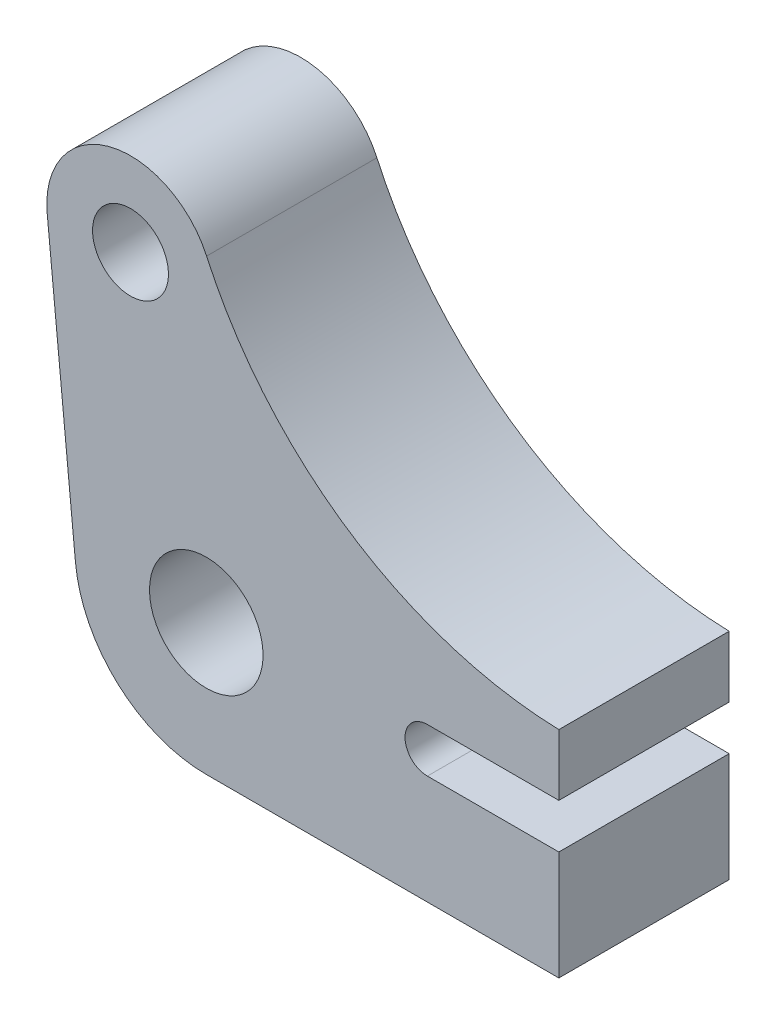
ISO-10303-21;
HEADER;
FILE_DESCRIPTION(('STEP AP214'),'2;1');
FILE_NAME('part.step','',(''),(''),'','','');
FILE_SCHEMA(('AUTOMOTIVE_DESIGN { 1 0 10303 214 1 1 1 1 }'));
ENDSEC;
DATA;
#1=APPLICATION_CONTEXT('core data for automotive mechanical design processes');
#2=APPLICATION_PROTOCOL_DEFINITION('international standard','automotive_design',2000,#1);
#3=PRODUCT_CONTEXT('',#1,'mechanical');
#4=PRODUCT('Part','Part','',(#3));
#5=PRODUCT_RELATED_PRODUCT_CATEGORY('part','',(#4));
#6=PRODUCT_DEFINITION_FORMATION('','',#4);
#7=PRODUCT_DEFINITION_CONTEXT('part definition',#1,'design');
#8=PRODUCT_DEFINITION('design','',#6,#7);
#9=PRODUCT_DEFINITION_SHAPE('','',#8);
#10=(LENGTH_UNIT() NAMED_UNIT(*) SI_UNIT(.MILLI.,.METRE.));
#11=(NAMED_UNIT(*) PLANE_ANGLE_UNIT() SI_UNIT($,.RADIAN.));
#12=(NAMED_UNIT(*) SI_UNIT($,.STERADIAN.) SOLID_ANGLE_UNIT());
#13=UNCERTAINTY_MEASURE_WITH_UNIT(LENGTH_MEASURE(1.E-05),#10,'distance_accuracy_value','');
#14=(GEOMETRIC_REPRESENTATION_CONTEXT(3) GLOBAL_UNCERTAINTY_ASSIGNED_CONTEXT((#13)) GLOBAL_UNIT_ASSIGNED_CONTEXT((#10,
#11,#12)) REPRESENTATION_CONTEXT('',''));
#15=CARTESIAN_POINT('',(0.,0.,0.));
#16=DIRECTION('',(0.,0.,1.));
#17=DIRECTION('',(1.,0.,0.));
#18=AXIS2_PLACEMENT_3D('',#15,#16,#17);
#19=CARTESIAN_POINT('',(-47.6545983323686,-60.0142566256791,28.5));
#20=DIRECTION('',(0.,0.,1.));
#21=DIRECTION('',(1.,0.,0.));
#22=AXIS2_PLACEMENT_3D('',#19,#20,#21);
#23=PLANE('',#22);
#24=CARTESIAN_POINT('',(-60.3367238394225,-12.6838890735103,28.5));
#25=DIRECTION('',(0.,0.,1.));
#26=DIRECTION('',(1.,0.,0.));
#27=AXIS2_PLACEMENT_3D('',#24,#25,#26);
#28=CIRCLE('',#27,6.3499999999899);
#29=CARTESIAN_POINT('',(-66.6867238394124,-12.6838890735103,28.5));
#30=VERTEX_POINT('',#29);
#31=EDGE_CURVE('E156',#30,#30,#28,.T.);
#32=ORIENTED_EDGE('',*,*,#31,.F.);
#33=EDGE_LOOP('',(#32));
#34=FACE_BOUND('',#33,.T.);
#35=CARTESIAN_POINT('',(-47.6545983323686,-60.0142566256791,28.5));
#36=DIRECTION('',(0.,0.,1.));
#37=DIRECTION('',(1.,0.,0.));
#38=AXIS2_PLACEMENT_3D('',#35,#36,#37);
#39=CIRCLE('',#38,22.);
#40=CARTESIAN_POINT('',(-69.5494691009146,-62.1624265511443,28.5));
#41=VERTEX_POINT('',#40);
#42=CARTESIAN_POINT('',(-47.6545983323686,-82.0142566256791,28.5));
#43=VERTEX_POINT('',#42);
#44=EDGE_CURVE('E171',#41,#43,#39,.T.);
#45=ORIENTED_EDGE('',*,*,#44,.T.);
#46=DIRECTION('',(1.,0.,0.));
#47=VECTOR('',#46,1.);
#48=CARTESIAN_POINT('',(11.3454016676313,-82.0142566256791,28.5));
#49=LINE('',#48,#47);
#50=CARTESIAN_POINT('',(11.3454016676313,-82.0142566256791,28.5));
#51=VERTEX_POINT('',#50);
#52=EDGE_CURVE('E109',#43,#51,#49,.T.);
#53=ORIENTED_EDGE('',*,*,#52,.T.);
#54=DIRECTION('',(0.,1.,0.));
#55=VECTOR('',#54,1.);
#56=CARTESIAN_POINT('',(11.3454016676313,-63.7511754118531,28.5));
#57=LINE('',#56,#55);
#58=CARTESIAN_POINT('',(11.3454016676313,-63.7511754118531,28.5));
#59=VERTEX_POINT('',#58);
#60=EDGE_CURVE('E192',#51,#59,#57,.T.);
#61=ORIENTED_EDGE('',*,*,#60,.T.);
#62=DIRECTION('',(-1.,0.,0.));
#63=VECTOR('',#62,1.);
#64=CARTESIAN_POINT('',(-10.6545983323687,-63.7511754118531,28.5));
#65=LINE('',#64,#63);
#66=CARTESIAN_POINT('',(-10.6545983323687,-63.7511754118531,28.5));
#67=VERTEX_POINT('',#66);
#68=EDGE_CURVE('E211',#59,#67,#65,.T.);
#69=ORIENTED_EDGE('',*,*,#68,.T.);
#70=CARTESIAN_POINT('',(-10.6545983323687,-60.0142566256791,28.5));
#71=DIRECTION('',(0.,0.,-1.));
#72=DIRECTION('',(-1.,0.,0.));
#73=AXIS2_PLACEMENT_3D('',#70,#71,#72);
#74=CIRCLE('',#73,3.73691878617401);
#75=CARTESIAN_POINT('',(-10.6545983323687,-56.2773378395051,28.5));
#76=VERTEX_POINT('',#75);
#77=EDGE_CURVE('E208',#67,#76,#74,.T.);
#78=ORIENTED_EDGE('',*,*,#77,.T.);
#79=DIRECTION('',(1.,0.,0.));
#80=VECTOR('',#79,1.);
#81=CARTESIAN_POINT('',(11.3454016676313,-56.2773378395051,28.5));
#82=LINE('',#81,#80);
#83=CARTESIAN_POINT('',(11.3454016676313,-56.2773378395051,28.5));
#84=VERTEX_POINT('',#83);
#85=EDGE_CURVE('E210',#76,#84,#82,.T.);
#86=ORIENTED_EDGE('',*,*,#85,.T.);
#87=DIRECTION('',(0.,1.,0.));
#88=VECTOR('',#87,1.);
#89=CARTESIAN_POINT('',(11.3454016676313,-46.0142566256791,28.5));
#90=LINE('',#89,#88);
#91=CARTESIAN_POINT('',(11.3454016676313,-46.0142566256791,28.5));
#92=VERTEX_POINT('',#91);
#93=EDGE_CURVE('E134',#84,#92,#90,.T.);
#94=ORIENTED_EDGE('',*,*,#93,.T.);
#95=CARTESIAN_POINT('',(13.3475250147251,20.9558225298888,28.5));
#96=DIRECTION('',(0.,0.,-1.));
#97=DIRECTION('',(1.,0.,0.));
#98=AXIS2_PLACEMENT_3D('',#95,#96,#97);
#99=CIRCLE('',#98,67.);
#100=CARTESIAN_POINT('',(-47.6011810263471,-6.86961963944554,28.5));
#101=VERTEX_POINT('',#100);
#102=EDGE_CURVE('E128',#92,#101,#99,.T.);
#103=ORIENTED_EDGE('',*,*,#102,.T.);
#104=CARTESIAN_POINT('',(-60.3367315423921,-12.6838911375154,28.5));
#105=DIRECTION('',(0.,0.,1.));
#106=DIRECTION('',(1.,0.,0.));
#107=AXIS2_PLACEMENT_3D('',#104,#105,#106);
#108=CIRCLE('',#107,14.);
#109=CARTESIAN_POINT('',(-74.2698311223758,-14.0509083628114,28.5));
#110=VERTEX_POINT('',#109);
#111=EDGE_CURVE('E132',#101,#110,#108,.T.);
#112=ORIENTED_EDGE('',*,*,#111,.T.);
#113=DIRECTION('',(0.0976440875211431,-0.995221398570269,0.));
#114=VECTOR('',#113,1.);
#115=CARTESIAN_POINT('',(-74.2698311223758,-14.0509083628114,28.5));
#116=LINE('',#115,#114);
#117=EDGE_CURVE('E60',#110,#41,#116,.T.);
#118=ORIENTED_EDGE('',*,*,#117,.T.);
#119=EDGE_LOOP('',(#45,#53,#61,#69,#78,#86,#94,#103,#112,#118));
#120=FACE_BOUND('',#119,.T.);
#121=CARTESIAN_POINT('',(-47.6545983323686,-60.0142566256791,28.5));
#122=DIRECTION('',(0.,0.,1.));
#123=DIRECTION('',(1.,0.,0.));
#124=AXIS2_PLACEMENT_3D('',#121,#122,#123);
#125=CIRCLE('',#124,9.5);
#126=CARTESIAN_POINT('',(-57.1545983323687,-60.0142566256791,28.5));
#127=VERTEX_POINT('',#126);
#128=EDGE_CURVE('E222',#127,#127,#125,.T.);
#129=ORIENTED_EDGE('',*,*,#128,.F.);
#130=EDGE_LOOP('',(#129));
#131=FACE_BOUND('',#130,.T.);
#132=ADVANCED_FACE('F43',(#34,#120,#131),#23,.T.);
#133=CARTESIAN_POINT('',(-47.6545983323686,-60.0142566256791,0.));
#134=DIRECTION('',(0.,0.,1.));
#135=DIRECTION('',(1.,0.,0.));
#136=AXIS2_PLACEMENT_3D('',#133,#134,#135);
#137=PLANE('',#136);
#138=CARTESIAN_POINT('',(-47.6545983323686,-60.0142566256791,0.));
#139=DIRECTION('',(0.,0.,1.));
#140=DIRECTION('',(1.,0.,0.));
#141=AXIS2_PLACEMENT_3D('',#138,#139,#140);
#142=CIRCLE('',#141,22.);
#143=CARTESIAN_POINT('',(-69.5494691009146,-62.1624265511443,0.));
#144=VERTEX_POINT('',#143);
#145=CARTESIAN_POINT('',(-47.6545983323686,-82.0142566256791,0.));
#146=VERTEX_POINT('',#145);
#147=EDGE_CURVE('E152',#144,#146,#142,.T.);
#148=ORIENTED_EDGE('',*,*,#147,.F.);
#149=DIRECTION('',(0.0976440875211431,-0.995221398570269,0.));
#150=VECTOR('',#149,1.);
#151=CARTESIAN_POINT('',(-74.2698311223758,-14.0509083628114,0.));
#152=LINE('',#151,#150);
#153=CARTESIAN_POINT('',(-74.2698311223758,-14.0509083628114,0.));
#154=VERTEX_POINT('',#153);
#155=EDGE_CURVE('E101',#154,#144,#152,.T.);
#156=ORIENTED_EDGE('',*,*,#155,.F.);
#157=CARTESIAN_POINT('',(-60.3367315423921,-12.6838911375154,0.));
#158=DIRECTION('',(0.,0.,1.));
#159=DIRECTION('',(1.,0.,0.));
#160=AXIS2_PLACEMENT_3D('',#157,#158,#159);
#161=CIRCLE('',#160,14.);
#162=CARTESIAN_POINT('',(-47.6011810263471,-6.86961963944554,0.));
#163=VERTEX_POINT('',#162);
#164=EDGE_CURVE('E95',#163,#154,#161,.T.);
#165=ORIENTED_EDGE('',*,*,#164,.F.);
#166=CARTESIAN_POINT('',(13.3475250147251,20.9558225298888,0.));
#167=DIRECTION('',(0.,0.,-1.));
#168=DIRECTION('',(1.,0.,0.));
#169=AXIS2_PLACEMENT_3D('',#166,#167,#168);
#170=CIRCLE('',#169,67.);
#171=CARTESIAN_POINT('',(11.3454016676313,-46.0142566256791,0.));
#172=VERTEX_POINT('',#171);
#173=EDGE_CURVE('E142',#172,#163,#170,.T.);
#174=ORIENTED_EDGE('',*,*,#173,.F.);
#175=DIRECTION('',(0.,1.,0.));
#176=VECTOR('',#175,1.);
#177=CARTESIAN_POINT('',(11.3454016676313,-46.0142566256791,0.));
#178=LINE('',#177,#176);
#179=CARTESIAN_POINT('',(11.3454016676313,-56.2773378395051,0.));
#180=VERTEX_POINT('',#179);
#181=EDGE_CURVE('E166',#180,#172,#178,.T.);
#182=ORIENTED_EDGE('',*,*,#181,.F.);
#183=DIRECTION('',(1.,0.,0.));
#184=VECTOR('',#183,1.);
#185=CARTESIAN_POINT('',(11.3454016676313,-56.2773378395051,0.));
#186=LINE('',#185,#184);
#187=CARTESIAN_POINT('',(-10.6545983323687,-56.2773378395051,0.));
#188=VERTEX_POINT('',#187);
#189=EDGE_CURVE('E164',#188,#180,#186,.T.);
#190=ORIENTED_EDGE('',*,*,#189,.F.);
#191=CARTESIAN_POINT('',(-10.6545983323687,-60.0142566256791,0.));
#192=DIRECTION('',(0.,0.,-1.));
#193=DIRECTION('',(-1.,0.,0.));
#194=AXIS2_PLACEMENT_3D('',#191,#192,#193);
#195=CIRCLE('',#194,3.73691878617401);
#196=CARTESIAN_POINT('',(-10.6545983323687,-63.7511754118531,0.));
#197=VERTEX_POINT('',#196);
#198=EDGE_CURVE('E162',#197,#188,#195,.T.);
#199=ORIENTED_EDGE('',*,*,#198,.F.);
#200=DIRECTION('',(-1.,0.,0.));
#201=VECTOR('',#200,1.);
#202=CARTESIAN_POINT('',(-10.6545983323687,-63.7511754118531,0.));
#203=LINE('',#202,#201);
#204=CARTESIAN_POINT('',(11.3454016676313,-63.7511754118531,0.));
#205=VERTEX_POINT('',#204);
#206=EDGE_CURVE('E160',#205,#197,#203,.T.);
#207=ORIENTED_EDGE('',*,*,#206,.F.);
#208=DIRECTION('',(0.,1.,0.));
#209=VECTOR('',#208,1.);
#210=CARTESIAN_POINT('',(11.3454016676313,-63.7511754118531,0.));
#211=LINE('',#210,#209);
#212=CARTESIAN_POINT('',(11.3454016676313,-82.0142566256791,0.));
#213=VERTEX_POINT('',#212);
#214=EDGE_CURVE('E158',#213,#205,#211,.T.);
#215=ORIENTED_EDGE('',*,*,#214,.F.);
#216=DIRECTION('',(1.,0.,0.));
#217=VECTOR('',#216,1.);
#218=CARTESIAN_POINT('',(11.3454016676313,-82.0142566256791,0.));
#219=LINE('',#218,#217);
#220=EDGE_CURVE('E155',#146,#213,#219,.T.);
#221=ORIENTED_EDGE('',*,*,#220,.F.);
#222=EDGE_LOOP('',(#148,#156,#165,#174,#182,#190,#199,#207,#215,#221));
#223=FACE_BOUND('',#222,.T.);
#224=CARTESIAN_POINT('',(-60.3367238394225,-12.6838890735103,0.));
#225=DIRECTION('',(0.,0.,1.));
#226=DIRECTION('',(1.,0.,0.));
#227=AXIS2_PLACEMENT_3D('',#224,#225,#226);
#228=CIRCLE('',#227,6.3499999999899);
#229=CARTESIAN_POINT('',(-66.6867238394124,-12.6838890735103,0.));
#230=VERTEX_POINT('',#229);
#231=EDGE_CURVE('E219',#230,#230,#228,.T.);
#232=ORIENTED_EDGE('',*,*,#231,.T.);
#233=EDGE_LOOP('',(#232));
#234=FACE_BOUND('',#233,.T.);
#235=CARTESIAN_POINT('',(-47.6545983323686,-60.0142566256791,0.));
#236=DIRECTION('',(0.,0.,1.));
#237=DIRECTION('',(1.,0.,0.));
#238=AXIS2_PLACEMENT_3D('',#235,#236,#237);
#239=CIRCLE('',#238,9.5);
#240=CARTESIAN_POINT('',(-57.1545983323687,-60.0142566256791,0.));
#241=VERTEX_POINT('',#240);
#242=EDGE_CURVE('E225',#241,#241,#239,.T.);
#243=ORIENTED_EDGE('',*,*,#242,.T.);
#244=EDGE_LOOP('',(#243));
#245=FACE_BOUND('',#244,.T.);
#246=ADVANCED_FACE('F196',(#223,#234,#245),#137,.F.);
#247=CARTESIAN_POINT('',(-47.6545983323686,-60.0142566256791,28.5));
#248=DIRECTION('',(0.,0.,-1.));
#249=DIRECTION('',(-1.,0.,0.));
#250=AXIS2_PLACEMENT_3D('',#247,#248,#249);
#251=CYLINDRICAL_SURFACE('',#250,22.);
#252=ORIENTED_EDGE('',*,*,#147,.T.);
#253=DIRECTION('',(0.,0.,-1.));
#254=VECTOR('',#253,1.);
#255=CARTESIAN_POINT('',(-47.6545983323686,-82.0142566256791,28.5));
#256=LINE('',#255,#254);
#257=EDGE_CURVE('E11',#43,#146,#256,.T.);
#258=ORIENTED_EDGE('',*,*,#257,.F.);
#259=ORIENTED_EDGE('',*,*,#44,.F.);
#260=DIRECTION('',(0.,0.,-1.));
#261=VECTOR('',#260,1.);
#262=CARTESIAN_POINT('',(-69.5494691009146,-62.1624265511443,28.5));
#263=LINE('',#262,#261);
#264=EDGE_CURVE('E148',#41,#144,#263,.T.);
#265=ORIENTED_EDGE('',*,*,#264,.T.);
#266=EDGE_LOOP('',(#252,#258,#259,#265));
#267=FACE_BOUND('',#266,.T.);
#268=ADVANCED_FACE('F45',(#267),#251,.T.);
#269=CARTESIAN_POINT('',(11.3454016676313,-82.0142566256791,28.5));
#270=DIRECTION('',(0.,1.,0.));
#271=DIRECTION('',(0.,0.,1.));
#272=AXIS2_PLACEMENT_3D('',#269,#270,#271);
#273=PLANE('',#272);
#274=ORIENTED_EDGE('',*,*,#220,.T.);
#275=DIRECTION('',(0.,0.,-1.));
#276=VECTOR('',#275,1.);
#277=CARTESIAN_POINT('',(11.3454016676313,-82.0142566256791,28.5));
#278=LINE('',#277,#276);
#279=EDGE_CURVE('E52',#51,#213,#278,.T.);
#280=ORIENTED_EDGE('',*,*,#279,.F.);
#281=ORIENTED_EDGE('',*,*,#52,.F.);
#282=ORIENTED_EDGE('',*,*,#257,.T.);
#283=EDGE_LOOP('',(#274,#280,#281,#282));
#284=FACE_BOUND('',#283,.T.);
#285=ADVANCED_FACE('F265',(#284),#273,.F.);
#286=CARTESIAN_POINT('',(11.3454016676313,-63.7511754118531,28.5));
#287=DIRECTION('',(-1.,0.,0.));
#288=DIRECTION('',(0.,0.,1.));
#289=AXIS2_PLACEMENT_3D('',#286,#287,#288);
#290=PLANE('',#289);
#291=ORIENTED_EDGE('',*,*,#214,.T.);
#292=DIRECTION('',(0.,0.,-1.));
#293=VECTOR('',#292,1.);
#294=CARTESIAN_POINT('',(11.3454016676313,-63.7511754118531,28.5));
#295=LINE('',#294,#293);
#296=EDGE_CURVE('E184',#59,#205,#295,.T.);
#297=ORIENTED_EDGE('',*,*,#296,.F.);
#298=ORIENTED_EDGE('',*,*,#60,.F.);
#299=ORIENTED_EDGE('',*,*,#279,.T.);
#300=EDGE_LOOP('',(#291,#297,#298,#299));
#301=FACE_BOUND('',#300,.T.);
#302=ADVANCED_FACE('F190',(#301),#290,.F.);
#303=CARTESIAN_POINT('',(-10.6545983323687,-63.7511754118531,28.5));
#304=DIRECTION('',(0.,-1.,0.));
#305=DIRECTION('',(0.,0.,-1.));
#306=AXIS2_PLACEMENT_3D('',#303,#304,#305);
#307=PLANE('',#306);
#308=ORIENTED_EDGE('',*,*,#206,.T.);
#309=DIRECTION('',(0.,0.,-1.));
#310=VECTOR('',#309,1.);
#311=CARTESIAN_POINT('',(-10.6545983323687,-63.7511754118531,28.5));
#312=LINE('',#311,#310);
#313=EDGE_CURVE('E181',#67,#197,#312,.T.);
#314=ORIENTED_EDGE('',*,*,#313,.F.);
#315=ORIENTED_EDGE('',*,*,#68,.F.);
#316=ORIENTED_EDGE('',*,*,#296,.T.);
#317=EDGE_LOOP('',(#308,#314,#315,#316));
#318=FACE_BOUND('',#317,.T.);
#319=ADVANCED_FACE('F202',(#318),#307,.F.);
#320=CARTESIAN_POINT('',(-10.6545983323687,-60.0142566256791,28.5));
#321=DIRECTION('',(0.,0.,-1.));
#322=DIRECTION('',(-1.,0.,0.));
#323=AXIS2_PLACEMENT_3D('',#320,#321,#322);
#324=CYLINDRICAL_SURFACE('',#323,3.73691878617401);
#325=ORIENTED_EDGE('',*,*,#198,.T.);
#326=DIRECTION('',(0.,0.,-1.));
#327=VECTOR('',#326,1.);
#328=CARTESIAN_POINT('',(-10.6545983323687,-56.2773378395051,28.5));
#329=LINE('',#328,#327);
#330=EDGE_CURVE('E178',#76,#188,#329,.T.);
#331=ORIENTED_EDGE('',*,*,#330,.F.);
#332=ORIENTED_EDGE('',*,*,#77,.F.);
#333=ORIENTED_EDGE('',*,*,#313,.T.);
#334=EDGE_LOOP('',(#325,#331,#332,#333));
#335=FACE_BOUND('',#334,.T.);
#336=ADVANCED_FACE('F206',(#335),#324,.F.);
#337=CARTESIAN_POINT('',(11.3454016676313,-56.2773378395051,28.5));
#338=DIRECTION('',(0.,1.,0.));
#339=DIRECTION('',(-1.,0.,0.));
#340=AXIS2_PLACEMENT_3D('',#337,#338,#339);
#341=PLANE('',#340);
#342=ORIENTED_EDGE('',*,*,#189,.T.);
#343=DIRECTION('',(0.,0.,-1.));
#344=VECTOR('',#343,1.);
#345=CARTESIAN_POINT('',(11.3454016676313,-56.2773378395051,28.5));
#346=LINE('',#345,#344);
#347=EDGE_CURVE('E175',#84,#180,#346,.T.);
#348=ORIENTED_EDGE('',*,*,#347,.F.);
#349=ORIENTED_EDGE('',*,*,#85,.F.);
#350=ORIENTED_EDGE('',*,*,#330,.T.);
#351=EDGE_LOOP('',(#342,#348,#349,#350));
#352=FACE_BOUND('',#351,.T.);
#353=ADVANCED_FACE('F255',(#352),#341,.F.);
#354=CARTESIAN_POINT('',(11.3454016676313,-46.0142566256791,28.5));
#355=DIRECTION('',(-1.,0.,0.));
#356=DIRECTION('',(0.,0.,1.));
#357=AXIS2_PLACEMENT_3D('',#354,#355,#356);
#358=PLANE('',#357);
#359=ORIENTED_EDGE('',*,*,#181,.T.);
#360=DIRECTION('',(0.,0.,-1.));
#361=VECTOR('',#360,1.);
#362=CARTESIAN_POINT('',(11.3454016676313,-46.0142566256791,28.5));
#363=LINE('',#362,#361);
#364=EDGE_CURVE('E143',#92,#172,#363,.T.);
#365=ORIENTED_EDGE('',*,*,#364,.F.);
#366=ORIENTED_EDGE('',*,*,#93,.F.);
#367=ORIENTED_EDGE('',*,*,#347,.T.);
#368=EDGE_LOOP('',(#359,#365,#366,#367));
#369=FACE_BOUND('',#368,.T.);
#370=ADVANCED_FACE('F252',(#369),#358,.F.);
#371=CARTESIAN_POINT('',(13.3475250147251,20.9558225298888,28.5));
#372=DIRECTION('',(0.,0.,-1.));
#373=DIRECTION('',(-1.,0.,0.));
#374=AXIS2_PLACEMENT_3D('',#371,#372,#373);
#375=CYLINDRICAL_SURFACE('',#374,67.);
#376=ORIENTED_EDGE('',*,*,#173,.T.);
#377=DIRECTION('',(0.,0.,-1.));
#378=VECTOR('',#377,1.);
#379=CARTESIAN_POINT('',(-47.6011810263471,-6.86961963944554,28.5));
#380=LINE('',#379,#378);
#381=EDGE_CURVE('E139',#101,#163,#380,.T.);
#382=ORIENTED_EDGE('',*,*,#381,.F.);
#383=ORIENTED_EDGE('',*,*,#102,.F.);
#384=ORIENTED_EDGE('',*,*,#364,.T.);
#385=EDGE_LOOP('',(#376,#382,#383,#384));
#386=FACE_BOUND('',#385,.T.);
#387=ADVANCED_FACE('F140',(#386),#375,.F.);
#388=CARTESIAN_POINT('',(-60.3367315423921,-12.6838911375154,28.5));
#389=DIRECTION('',(0.,0.,-1.));
#390=DIRECTION('',(-1.,0.,0.));
#391=AXIS2_PLACEMENT_3D('',#388,#389,#390);
#392=CYLINDRICAL_SURFACE('',#391,14.);
#393=ORIENTED_EDGE('',*,*,#164,.T.);
#394=DIRECTION('',(0.,0.,-1.));
#395=VECTOR('',#394,1.);
#396=CARTESIAN_POINT('',(-74.2698311223758,-14.0509083628114,28.5));
#397=LINE('',#396,#395);
#398=EDGE_CURVE('E144',#110,#154,#397,.T.);
#399=ORIENTED_EDGE('',*,*,#398,.F.);
#400=ORIENTED_EDGE('',*,*,#111,.F.);
#401=ORIENTED_EDGE('',*,*,#381,.T.);
#402=EDGE_LOOP('',(#393,#399,#400,#401));
#403=FACE_BOUND('',#402,.T.);
#404=ADVANCED_FACE('F146',(#403),#392,.T.);
#405=CARTESIAN_POINT('',(-74.2698311223758,-14.0509083628114,28.5));
#406=DIRECTION('',(0.995221398570269,0.0976440875211431,0.));
#407=DIRECTION('',(-0.0976440875211431,0.99522139857027,0.));
#408=AXIS2_PLACEMENT_3D('',#405,#406,#407);
#409=PLANE('',#408);
#410=ORIENTED_EDGE('',*,*,#155,.T.);
#411=ORIENTED_EDGE('',*,*,#264,.F.);
#412=ORIENTED_EDGE('',*,*,#117,.F.);
#413=ORIENTED_EDGE('',*,*,#398,.T.);
#414=EDGE_LOOP('',(#410,#411,#412,#413));
#415=FACE_BOUND('',#414,.T.);
#416=ADVANCED_FACE('F245',(#415),#409,.F.);
#417=CARTESIAN_POINT('',(-60.3367238394225,-12.6838890735103,28.5));
#418=DIRECTION('',(0.,0.,-1.));
#419=DIRECTION('',(-1.,0.,0.));
#420=AXIS2_PLACEMENT_3D('',#417,#418,#419);
#421=CYLINDRICAL_SURFACE('',#420,6.3499999999899);
#422=CARTESIAN_POINT('',(-66.6867238394124,-12.6838890735103,28.5));
#423=CARTESIAN_POINT('',(-66.6867238394124,-12.6838890735103,28.203125));
#424=CARTESIAN_POINT('',(-66.6867238394124,-12.6838890735103,27.90625));
#425=CARTESIAN_POINT('',(-66.6867238394124,-12.6838890735103,27.3125));
#426=CARTESIAN_POINT('',(-66.6867238394124,-12.6838890735103,27.015625));
#427=CARTESIAN_POINT('',(-66.6867238394124,-12.6838890735103,26.421875));
#428=CARTESIAN_POINT('',(-66.6867238394124,-12.6838890735103,26.125));
#429=CARTESIAN_POINT('',(-66.6867238394124,-12.6838890735103,25.53125));
#430=CARTESIAN_POINT('',(-66.6867238394124,-12.6838890735103,25.234375));
#431=CARTESIAN_POINT('',(-66.6867238394124,-12.6838890735103,24.640625));
#432=CARTESIAN_POINT('',(-66.6867238394124,-12.6838890735103,24.34375));
#433=CARTESIAN_POINT('',(-66.6867238394124,-12.6838890735103,23.75));
#434=CARTESIAN_POINT('',(-66.6867238394124,-12.6838890735103,23.453125));
#435=CARTESIAN_POINT('',(-66.6867238394124,-12.6838890735103,22.859375));
#436=CARTESIAN_POINT('',(-66.6867238394124,-12.6838890735103,22.5625));
#437=CARTESIAN_POINT('',(-66.6867238394124,-12.6838890735103,21.96875));
#438=CARTESIAN_POINT('',(-66.6867238394124,-12.6838890735103,21.671875));
#439=CARTESIAN_POINT('',(-66.6867238394124,-12.6838890735103,21.078125));
#440=CARTESIAN_POINT('',(-66.6867238394124,-12.6838890735103,20.78125));
#441=CARTESIAN_POINT('',(-66.6867238394124,-12.6838890735103,20.1875));
#442=CARTESIAN_POINT('',(-66.6867238394124,-12.6838890735103,19.890625));
#443=CARTESIAN_POINT('',(-66.6867238394124,-12.6838890735103,19.296875));
#444=CARTESIAN_POINT('',(-66.6867238394124,-12.6838890735103,19.));
#445=CARTESIAN_POINT('',(-66.6867238394124,-12.6838890735103,18.40625));
#446=CARTESIAN_POINT('',(-66.6867238394124,-12.6838890735103,18.109375));
#447=CARTESIAN_POINT('',(-66.6867238394124,-12.6838890735103,17.515625));
#448=CARTESIAN_POINT('',(-66.6867238394124,-12.6838890735103,17.21875));
#449=CARTESIAN_POINT('',(-66.6867238394124,-12.6838890735103,16.625));
#450=CARTESIAN_POINT('',(-66.6867238394124,-12.6838890735103,16.328125));
#451=CARTESIAN_POINT('',(-66.6867238394124,-12.6838890735103,15.734375));
#452=CARTESIAN_POINT('',(-66.6867238394124,-12.6838890735103,15.4375));
#453=CARTESIAN_POINT('',(-66.6867238394124,-12.6838890735103,14.84375));
#454=CARTESIAN_POINT('',(-66.6867238394124,-12.6838890735103,14.546875));
#455=CARTESIAN_POINT('',(-66.6867238394124,-12.6838890735103,13.953125));
#456=CARTESIAN_POINT('',(-66.6867238394124,-12.6838890735103,13.65625));
#457=CARTESIAN_POINT('',(-66.6867238394124,-12.6838890735103,13.0625));
#458=CARTESIAN_POINT('',(-66.6867238394124,-12.6838890735103,12.765625));
#459=CARTESIAN_POINT('',(-66.6867238394124,-12.6838890735103,12.171875));
#460=CARTESIAN_POINT('',(-66.6867238394124,-12.6838890735103,11.875));
#461=CARTESIAN_POINT('',(-66.6867238394124,-12.6838890735103,11.28125));
#462=CARTESIAN_POINT('',(-66.6867238394124,-12.6838890735103,10.984375));
#463=CARTESIAN_POINT('',(-66.6867238394124,-12.6838890735103,10.390625));
#464=CARTESIAN_POINT('',(-66.6867238394124,-12.6838890735103,10.09375));
#465=CARTESIAN_POINT('',(-66.6867238394124,-12.6838890735103,9.5));
#466=CARTESIAN_POINT('',(-66.6867238394124,-12.6838890735103,9.203125));
#467=CARTESIAN_POINT('',(-66.6867238394124,-12.6838890735103,8.609375));
#468=CARTESIAN_POINT('',(-66.6867238394124,-12.6838890735103,8.3125));
#469=CARTESIAN_POINT('',(-66.6867238394124,-12.6838890735103,7.71875));
#470=CARTESIAN_POINT('',(-66.6867238394124,-12.6838890735103,7.421875));
#471=CARTESIAN_POINT('',(-66.6867238394124,-12.6838890735103,6.828125));
#472=CARTESIAN_POINT('',(-66.6867238394124,-12.6838890735103,6.53125));
#473=CARTESIAN_POINT('',(-66.6867238394124,-12.6838890735103,5.9375));
#474=CARTESIAN_POINT('',(-66.6867238394124,-12.6838890735103,5.640625));
#475=CARTESIAN_POINT('',(-66.6867238394124,-12.6838890735103,5.046875));
#476=CARTESIAN_POINT('',(-66.6867238394124,-12.6838890735103,4.75));
#477=CARTESIAN_POINT('',(-66.6867238394124,-12.6838890735103,4.15625));
#478=CARTESIAN_POINT('',(-66.6867238394124,-12.6838890735103,3.859375));
#479=CARTESIAN_POINT('',(-66.6867238394124,-12.6838890735103,3.265625));
#480=CARTESIAN_POINT('',(-66.6867238394124,-12.6838890735103,2.96875));
#481=CARTESIAN_POINT('',(-66.6867238394124,-12.6838890735103,2.375));
#482=CARTESIAN_POINT('',(-66.6867238394124,-12.6838890735103,2.078125));
#483=CARTESIAN_POINT('',(-66.6867238394124,-12.6838890735103,1.484375));
#484=CARTESIAN_POINT('',(-66.6867238394124,-12.6838890735103,1.1875));
#485=CARTESIAN_POINT('',(-66.6867238394124,-12.6838890735103,0.593749999999999));
#486=CARTESIAN_POINT('',(-66.6867238394124,-12.6838890735103,0.296875));
#487=CARTESIAN_POINT('',(-66.6867238394124,-12.6838890735103,0.));
#488=B_SPLINE_CURVE_WITH_KNOTS('',3,(#422,#423,#424,#425,#426,#427,#428,#429,#430,#431,#432,
#433,#434,#435,#436,#437,#438,#439,#440,#441,#442,#443,#444,#445,#446,#447,#448,#449,#450,#451,
#452,#453,#454,#455,#456,#457,#458,#459,#460,#461,#462,#463,#464,#465,#466,#467,#468,#469,#470,
#471,#472,#473,#474,#475,#476,#477,#478,#479,#480,#481,#482,#483,#484,#485,#486,#487),
.UNSPECIFIED.,.F.,.F.,(4,2,2,2,2,2,2,2,2,2,2,2,2,2,2,2,2,2,2,2,2,2,2,2,2,2,2,2,2,2,2,2,4),(0.,
0.890624999999999,1.78125,2.671875,3.5625,4.453125,5.34375,6.234375,7.125,8.015625,8.90625,
9.796875,10.6875,11.578125,12.46875,13.359375,14.25,15.140625,16.03125,16.921875,17.8125,
18.703125,19.59375,20.484375,21.375,22.265625,23.15625,24.046875,24.9375,25.828125,26.71875,
27.609375,28.5),.UNSPECIFIED.);
#489=EDGE_CURVE('BSEAM242',#30,#230,#488,.T.);
#490=ORIENTED_EDGE('',*,*,#31,.T.);
#491=ORIENTED_EDGE('',*,*,#231,.F.);
#492=ORIENTED_EDGE('',*,*,#489,.T.);
#493=ORIENTED_EDGE('',*,*,#489,.F.);
#494=EDGE_LOOP('',(#490,#492,#491,#493));
#495=FACE_BOUND('',#494,.T.);
#496=ADVANCED_FACE('F242',(#495),#421,.F.);
#497=CARTESIAN_POINT('',(-47.6545983323686,-60.0142566256791,28.5));
#498=DIRECTION('',(0.,0.,-1.));
#499=DIRECTION('',(-1.,0.,0.));
#500=AXIS2_PLACEMENT_3D('',#497,#498,#499);
#501=CYLINDRICAL_SURFACE('',#500,9.5);
#502=CARTESIAN_POINT('',(-57.1545983323687,-60.0142566256791,28.5));
#503=CARTESIAN_POINT('',(-57.1545983323687,-60.0142566256791,28.203125));
#504=CARTESIAN_POINT('',(-57.1545983323687,-60.0142566256791,27.90625));
#505=CARTESIAN_POINT('',(-57.1545983323687,-60.0142566256791,27.3125));
#506=CARTESIAN_POINT('',(-57.1545983323687,-60.0142566256791,27.015625));
#507=CARTESIAN_POINT('',(-57.1545983323687,-60.0142566256791,26.421875));
#508=CARTESIAN_POINT('',(-57.1545983323687,-60.0142566256791,26.125));
#509=CARTESIAN_POINT('',(-57.1545983323687,-60.0142566256791,25.53125));
#510=CARTESIAN_POINT('',(-57.1545983323687,-60.0142566256791,25.234375));
#511=CARTESIAN_POINT('',(-57.1545983323687,-60.0142566256791,24.640625));
#512=CARTESIAN_POINT('',(-57.1545983323687,-60.0142566256791,24.34375));
#513=CARTESIAN_POINT('',(-57.1545983323687,-60.0142566256791,23.75));
#514=CARTESIAN_POINT('',(-57.1545983323687,-60.0142566256791,23.453125));
#515=CARTESIAN_POINT('',(-57.1545983323687,-60.0142566256791,22.859375));
#516=CARTESIAN_POINT('',(-57.1545983323687,-60.0142566256791,22.5625));
#517=CARTESIAN_POINT('',(-57.1545983323687,-60.0142566256791,21.96875));
#518=CARTESIAN_POINT('',(-57.1545983323687,-60.0142566256791,21.671875));
#519=CARTESIAN_POINT('',(-57.1545983323687,-60.0142566256791,21.078125));
#520=CARTESIAN_POINT('',(-57.1545983323687,-60.0142566256791,20.78125));
#521=CARTESIAN_POINT('',(-57.1545983323687,-60.0142566256791,20.1875));
#522=CARTESIAN_POINT('',(-57.1545983323687,-60.0142566256791,19.890625));
#523=CARTESIAN_POINT('',(-57.1545983323687,-60.0142566256791,19.296875));
#524=CARTESIAN_POINT('',(-57.1545983323687,-60.0142566256791,19.));
#525=CARTESIAN_POINT('',(-57.1545983323687,-60.0142566256791,18.40625));
#526=CARTESIAN_POINT('',(-57.1545983323687,-60.0142566256791,18.109375));
#527=CARTESIAN_POINT('',(-57.1545983323687,-60.0142566256791,17.515625));
#528=CARTESIAN_POINT('',(-57.1545983323687,-60.0142566256791,17.21875));
#529=CARTESIAN_POINT('',(-57.1545983323687,-60.0142566256791,16.625));
#530=CARTESIAN_POINT('',(-57.1545983323687,-60.0142566256791,16.328125));
#531=CARTESIAN_POINT('',(-57.1545983323687,-60.0142566256791,15.734375));
#532=CARTESIAN_POINT('',(-57.1545983323687,-60.0142566256791,15.4375));
#533=CARTESIAN_POINT('',(-57.1545983323687,-60.0142566256791,14.84375));
#534=CARTESIAN_POINT('',(-57.1545983323687,-60.0142566256791,14.546875));
#535=CARTESIAN_POINT('',(-57.1545983323687,-60.0142566256791,13.953125));
#536=CARTESIAN_POINT('',(-57.1545983323687,-60.0142566256791,13.65625));
#537=CARTESIAN_POINT('',(-57.1545983323687,-60.0142566256791,13.0625));
#538=CARTESIAN_POINT('',(-57.1545983323687,-60.0142566256791,12.765625));
#539=CARTESIAN_POINT('',(-57.1545983323687,-60.0142566256791,12.171875));
#540=CARTESIAN_POINT('',(-57.1545983323687,-60.0142566256791,11.875));
#541=CARTESIAN_POINT('',(-57.1545983323687,-60.0142566256791,11.28125));
#542=CARTESIAN_POINT('',(-57.1545983323687,-60.0142566256791,10.984375));
#543=CARTESIAN_POINT('',(-57.1545983323687,-60.0142566256791,10.390625));
#544=CARTESIAN_POINT('',(-57.1545983323687,-60.0142566256791,10.09375));
#545=CARTESIAN_POINT('',(-57.1545983323687,-60.0142566256791,9.5));
#546=CARTESIAN_POINT('',(-57.1545983323687,-60.0142566256791,9.203125));
#547=CARTESIAN_POINT('',(-57.1545983323687,-60.0142566256791,8.609375));
#548=CARTESIAN_POINT('',(-57.1545983323687,-60.0142566256791,8.3125));
#549=CARTESIAN_POINT('',(-57.1545983323687,-60.0142566256791,7.71875));
#550=CARTESIAN_POINT('',(-57.1545983323687,-60.0142566256791,7.421875));
#551=CARTESIAN_POINT('',(-57.1545983323687,-60.0142566256791,6.828125));
#552=CARTESIAN_POINT('',(-57.1545983323687,-60.0142566256791,6.53125));
#553=CARTESIAN_POINT('',(-57.1545983323687,-60.0142566256791,5.9375));
#554=CARTESIAN_POINT('',(-57.1545983323687,-60.0142566256791,5.640625));
#555=CARTESIAN_POINT('',(-57.1545983323687,-60.0142566256791,5.046875));
#556=CARTESIAN_POINT('',(-57.1545983323687,-60.0142566256791,4.75));
#557=CARTESIAN_POINT('',(-57.1545983323687,-60.0142566256791,4.15625));
#558=CARTESIAN_POINT('',(-57.1545983323687,-60.0142566256791,3.859375));
#559=CARTESIAN_POINT('',(-57.1545983323687,-60.0142566256791,3.265625));
#560=CARTESIAN_POINT('',(-57.1545983323687,-60.0142566256791,2.96875));
#561=CARTESIAN_POINT('',(-57.1545983323687,-60.0142566256791,2.375));
#562=CARTESIAN_POINT('',(-57.1545983323687,-60.0142566256791,2.078125));
#563=CARTESIAN_POINT('',(-57.1545983323687,-60.0142566256791,1.484375));
#564=CARTESIAN_POINT('',(-57.1545983323687,-60.0142566256791,1.1875));
#565=CARTESIAN_POINT('',(-57.1545983323687,-60.0142566256791,0.593749999999999));
#566=CARTESIAN_POINT('',(-57.1545983323687,-60.0142566256791,0.296875));
#567=CARTESIAN_POINT('',(-57.1545983323687,-60.0142566256791,0.));
#568=B_SPLINE_CURVE_WITH_KNOTS('',3,(#502,#503,#504,#505,#506,#507,#508,#509,#510,#511,#512,
#513,#514,#515,#516,#517,#518,#519,#520,#521,#522,#523,#524,#525,#526,#527,#528,#529,#530,#531,
#532,#533,#534,#535,#536,#537,#538,#539,#540,#541,#542,#543,#544,#545,#546,#547,#548,#549,#550,
#551,#552,#553,#554,#555,#556,#557,#558,#559,#560,#561,#562,#563,#564,#565,#566,#567),
.UNSPECIFIED.,.F.,.F.,(4,2,2,2,2,2,2,2,2,2,2,2,2,2,2,2,2,2,2,2,2,2,2,2,2,2,2,2,2,2,2,2,4),(0.,
0.890625000000003,1.78125,2.671875,3.5625,4.453125,5.34375,6.234375,7.125,8.015625,8.90625,
9.796875,10.6875,11.578125,12.46875,13.359375,14.25,15.140625,16.03125,16.921875,17.8125,
18.703125,19.59375,20.484375,21.375,22.265625,23.15625,24.046875,24.9375,25.828125,26.71875,
27.609375,28.5),.UNSPECIFIED.);
#569=EDGE_CURVE('BSEAM231',#127,#241,#568,.T.);
#570=ORIENTED_EDGE('',*,*,#128,.T.);
#571=ORIENTED_EDGE('',*,*,#242,.F.);
#572=ORIENTED_EDGE('',*,*,#569,.T.);
#573=ORIENTED_EDGE('',*,*,#569,.F.);
#574=EDGE_LOOP('',(#570,#572,#571,#573));
#575=FACE_BOUND('',#574,.T.);
#576=ADVANCED_FACE('F231',(#575),#501,.F.);
#577=CLOSED_SHELL('',(#132,#246,#268,#285,#302,#319,#336,#353,#370,#387,#404,#416,#496,#576));
#578=MANIFOLD_SOLID_BREP('B2',#577);
#579=ADVANCED_BREP_SHAPE_REPRESENTATION('',(#18,#578),#14);
#580=SHAPE_DEFINITION_REPRESENTATION(#9,#579);
ENDSEC;
END-ISO-10303-21;
